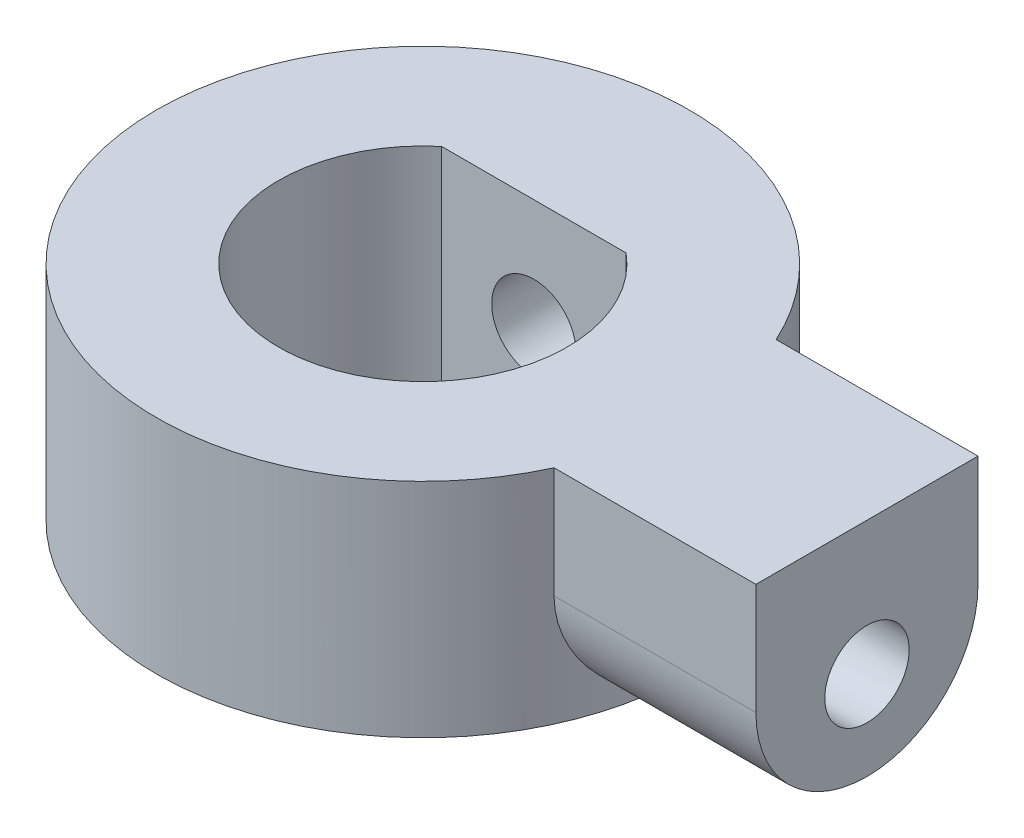
ISO-10303-21;
HEADER;
FILE_DESCRIPTION(('STEP AP214'),'2;1');
FILE_NAME('part.step','',(''),(''),'','','');
FILE_SCHEMA(('AUTOMOTIVE_DESIGN { 1 0 10303 214 1 1 1 1 }'));
ENDSEC;
DATA;
#1=APPLICATION_CONTEXT('core data for automotive mechanical design processes');
#2=APPLICATION_PROTOCOL_DEFINITION('international standard','automotive_design',2000,#1);
#3=PRODUCT_CONTEXT('',#1,'mechanical');
#4=PRODUCT('Part','Part','',(#3));
#5=PRODUCT_RELATED_PRODUCT_CATEGORY('part','',(#4));
#6=PRODUCT_DEFINITION_FORMATION('','',#4);
#7=PRODUCT_DEFINITION_CONTEXT('part definition',#1,'design');
#8=PRODUCT_DEFINITION('design','',#6,#7);
#9=PRODUCT_DEFINITION_SHAPE('','',#8);
#10=(LENGTH_UNIT() NAMED_UNIT(*) SI_UNIT(.MILLI.,.METRE.));
#11=(NAMED_UNIT(*) PLANE_ANGLE_UNIT() SI_UNIT($,.RADIAN.));
#12=(NAMED_UNIT(*) SI_UNIT($,.STERADIAN.) SOLID_ANGLE_UNIT());
#13=UNCERTAINTY_MEASURE_WITH_UNIT(LENGTH_MEASURE(1.E-05),#10,'distance_accuracy_value','');
#14=(GEOMETRIC_REPRESENTATION_CONTEXT(3) GLOBAL_UNCERTAINTY_ASSIGNED_CONTEXT((#13)) GLOBAL_UNIT_ASSIGNED_CONTEXT((#10,
#11,#12)) REPRESENTATION_CONTEXT('',''));
#15=CARTESIAN_POINT('',(0.,0.,0.));
#16=DIRECTION('',(0.,0.,1.));
#17=DIRECTION('',(1.,0.,0.));
#18=AXIS2_PLACEMENT_3D('',#15,#16,#17);
#19=CARTESIAN_POINT('',(0.,5.,0.));
#20=DIRECTION('',(0.,1.,0.));
#21=DIRECTION('',(0.,0.,1.));
#22=AXIS2_PLACEMENT_3D('',#19,#20,#21);
#23=PLANE('',#22);
#24=CARTESIAN_POINT('',(0.,5.,0.));
#25=DIRECTION('',(0.,1.,0.));
#26=DIRECTION('',(0.,0.,1.));
#27=AXIS2_PLACEMENT_3D('',#24,#25,#26);
#28=CIRCLE('',#27,6.);
#29=CARTESIAN_POINT('',(5.45435605731786,5.,-2.5));
#30=VERTEX_POINT('',#29);
#31=CARTESIAN_POINT('',(5.45435605731786,5.,2.5));
#32=VERTEX_POINT('',#31);
#33=EDGE_CURVE('E47',#30,#32,#28,.T.);
#34=ORIENTED_EDGE('',*,*,#33,.T.);
#35=DIRECTION('',(1.,0.,0.));
#36=VECTOR('',#35,1.);
#37=CARTESIAN_POINT('',(-6.001,5.,2.5));
#38=LINE('',#37,#36);
#39=CARTESIAN_POINT('',(10.,5.,2.5));
#40=VERTEX_POINT('',#39);
#41=EDGE_CURVE('E105',#32,#40,#38,.T.);
#42=ORIENTED_EDGE('',*,*,#41,.T.);
#43=DIRECTION('',(0.,0.,1.));
#44=VECTOR('',#43,1.);
#45=CARTESIAN_POINT('',(10.,5.,2.5));
#46=LINE('',#45,#44);
#47=CARTESIAN_POINT('',(10.,5.,-2.5));
#48=VERTEX_POINT('',#47);
#49=EDGE_CURVE('E164',#48,#40,#46,.T.);
#50=ORIENTED_EDGE('',*,*,#49,.F.);
#51=DIRECTION('',(1.,0.,0.));
#52=VECTOR('',#51,1.);
#53=CARTESIAN_POINT('',(-6.001,5.,-2.5));
#54=LINE('',#53,#52);
#55=EDGE_CURVE('E180',#30,#48,#54,.T.);
#56=ORIENTED_EDGE('',*,*,#55,.F.);
#57=EDGE_LOOP('',(#34,#42,#50,#56));
#58=FACE_BOUND('',#57,.T.);
#59=DIRECTION('',(-1.,0.,0.));
#60=VECTOR('',#59,1.);
#61=CARTESIAN_POINT('',(-2.07665596572952,5.,-2.5));
#62=LINE('',#61,#60);
#63=CARTESIAN_POINT('',(2.07665596572952,5.,-2.5));
#64=VERTEX_POINT('',#63);
#65=CARTESIAN_POINT('',(-2.07665596572952,5.,-2.5));
#66=VERTEX_POINT('',#65);
#67=EDGE_CURVE('E167',#64,#66,#62,.T.);
#68=ORIENTED_EDGE('',*,*,#67,.F.);
#69=CARTESIAN_POINT('',(0.,5.,0.));
#70=DIRECTION('',(0.,1.,0.));
#71=DIRECTION('',(0.,0.,1.));
#72=AXIS2_PLACEMENT_3D('',#69,#70,#71);
#73=CIRCLE('',#72,3.25);
#74=EDGE_CURVE('E162',#66,#64,#73,.T.);
#75=ORIENTED_EDGE('',*,*,#74,.F.);
#76=EDGE_LOOP('',(#68,#75));
#77=FACE_BOUND('',#76,.T.);
#78=ADVANCED_FACE('F37',(#58,#77),#23,.T.);
#79=CARTESIAN_POINT('',(0.,0.,0.));
#80=DIRECTION('',(0.,1.,0.));
#81=DIRECTION('',(0.,0.,1.));
#82=AXIS2_PLACEMENT_3D('',#79,#80,#81);
#83=PLANE('',#82);
#84=CARTESIAN_POINT('',(0.,0.,0.));
#85=DIRECTION('',(0.,1.,0.));
#86=DIRECTION('',(0.,0.,1.));
#87=AXIS2_PLACEMENT_3D('',#84,#85,#86);
#88=CIRCLE('',#87,6.);
#89=CARTESIAN_POINT('',(6.,0.,0.));
#90=VERTEX_POINT('',#89);
#91=EDGE_CURVE('E116',#90,#90,#88,.T.);
#92=ORIENTED_EDGE('',*,*,#91,.F.);
#93=EDGE_LOOP('',(#92));
#94=FACE_BOUND('',#93,.T.);
#95=CARTESIAN_POINT('',(0.,0.,0.));
#96=DIRECTION('',(0.,1.,0.));
#97=DIRECTION('',(0.,0.,1.));
#98=AXIS2_PLACEMENT_3D('',#95,#96,#97);
#99=CIRCLE('',#98,3.25);
#100=CARTESIAN_POINT('',(-2.07665596572952,0.,-2.5));
#101=VERTEX_POINT('',#100);
#102=CARTESIAN_POINT('',(2.07665596572952,0.,-2.5));
#103=VERTEX_POINT('',#102);
#104=EDGE_CURVE('E156',#101,#103,#99,.T.);
#105=ORIENTED_EDGE('',*,*,#104,.T.);
#106=DIRECTION('',(-1.,0.,0.));
#107=VECTOR('',#106,1.);
#108=CARTESIAN_POINT('',(-2.07665596572952,0.,-2.5));
#109=LINE('',#108,#107);
#110=EDGE_CURVE('E157',#103,#101,#109,.T.);
#111=ORIENTED_EDGE('',*,*,#110,.T.);
#112=EDGE_LOOP('',(#105,#111));
#113=FACE_BOUND('',#112,.T.);
#114=ADVANCED_FACE('F145',(#94,#113),#83,.F.);
#115=CARTESIAN_POINT('',(0.,5.,0.));
#116=DIRECTION('',(0.,-1.,0.));
#117=DIRECTION('',(0.,0.,-1.));
#118=AXIS2_PLACEMENT_3D('',#115,#116,#117);
#119=CYLINDRICAL_SURFACE('',#118,6.);
#120=CARTESIAN_POINT('',(0.,3.45,-6.));
#121=CARTESIAN_POINT('',(-0.0530065325431377,3.44999784247442,-5.99999911943663));
#122=CARTESIAN_POINT('',(-0.1060429328237,3.44554866162129,-5.99929023721847));
#123=CARTESIAN_POINT('',(-0.210630821019885,3.42787540710383,-5.99653060786158));
#124=CARTESIAN_POINT('',(-0.262180853919116,3.41464302074474,-5.9944785895633));
#125=CARTESIAN_POINT('',(-0.362267483212806,3.37981073380928,-5.98926307465124));
#126=CARTESIAN_POINT('',(-0.410806414129141,3.35821741200426,-5.98610045209399));
#127=CARTESIAN_POINT('',(-0.503565253669326,3.30729285605072,-5.97901235357637));
#128=CARTESIAN_POINT('',(-0.547785709361367,3.27796260377012,-5.97508697443153));
#129=CARTESIAN_POINT('',(-0.631042339550759,3.21212618428269,-5.96687118067805));
#130=CARTESIAN_POINT('',(-0.670035666337855,3.17556614987959,-5.962578172111));
#131=CARTESIAN_POINT('',(-0.741361261922617,3.09642390940615,-5.95413105122261));
#132=CARTESIAN_POINT('',(-0.773693129794643,3.0538413411244,-5.94997694727396));
#133=CARTESIAN_POINT('',(-0.830947245411496,2.96357172598603,-5.94225284052595));
#134=CARTESIAN_POINT('',(-0.855827586939495,2.9158577880124,-5.93868619016023));
#135=CARTESIAN_POINT('',(-0.897204497579997,2.81686215214227,-5.93257652760938));
#136=CARTESIAN_POINT('',(-0.913701576590684,2.76558067145146,-5.93003345316887));
#137=CARTESIAN_POINT('',(-0.937709647092883,2.66135806074548,-5.92628454466767));
#138=CARTESIAN_POINT('',(-0.945294303425467,2.60843430111831,-5.92506775447841));
#139=CARTESIAN_POINT('',(-0.951490528668378,2.50205235320494,-5.92407598286326));
#140=CARTESIAN_POINT('',(-0.950102670970175,2.44859419928739,-5.92430090930399));
#141=CARTESIAN_POINT('',(-0.938453367789073,2.34318398231397,-5.9261571457424));
#142=CARTESIAN_POINT('',(-0.928274310170595,2.29122255100579,-5.92777539758069));
#143=CARTESIAN_POINT('',(-0.899460681487422,2.18975452051614,-5.93221553010633));
#144=CARTESIAN_POINT('',(-0.880825846355845,2.14024799805299,-5.935037448383));
#145=CARTESIAN_POINT('',(-0.835545003436381,2.04484638766363,-5.9415812241455));
#146=CARTESIAN_POINT('',(-0.808864433030597,1.99896798058484,-5.94530695040069));
#147=CARTESIAN_POINT('',(-0.748274060371904,1.91230812768371,-5.95323580549352));
#148=CARTESIAN_POINT('',(-0.714363730423339,1.87152705425743,-5.95743896916855));
#149=CARTESIAN_POINT('',(-0.639825820380716,1.7957422891208,-5.96590665026745));
#150=CARTESIAN_POINT('',(-0.599127476713979,1.76080817727663,-5.97017132879133));
#151=CARTESIAN_POINT('',(-0.51240909068589,1.69825494558224,-5.97823804067464));
#152=CARTESIAN_POINT('',(-0.466389019949385,1.67063586473794,-5.98204007156704));
#153=CARTESIAN_POINT('',(-0.370270720231182,1.6234917835946,-5.98875774964505));
#154=CARTESIAN_POINT('',(-0.320169625526924,1.60397253069736,-5.99167276704191));
#155=CARTESIAN_POINT('',(-0.217344001328876,1.57364466071927,-5.9962828177001));
#156=CARTESIAN_POINT('',(-0.164619669983096,1.56283538678146,-5.99797794295772));
#157=CARTESIAN_POINT('',(-0.0586443500683351,1.55032771006647,-5.99994493994887));
#158=CARTESIAN_POINT('',(-0.00540491062864297,1.54853371746608,-6.00023174349367));
#159=CARTESIAN_POINT('',(0.100614180366432,1.55385325692318,-5.99939055035239));
#160=CARTESIAN_POINT('',(0.153393847770229,1.56096648071433,-5.99826260262888));
#161=CARTESIAN_POINT('',(0.2567028442159,1.58381903517933,-5.99472788186909));
#162=CARTESIAN_POINT('',(0.307242814998402,1.599511427333,-5.99232806964974));
#163=CARTESIAN_POINT('',(0.404974502660587,1.63902710772779,-5.98651772171067));
#164=CARTESIAN_POINT('',(0.452166046878417,1.66285081489323,-5.98310713391711));
#165=CARTESIAN_POINT('',(0.54227912712009,1.71817451705975,-5.97561683521777));
#166=CARTESIAN_POINT('',(0.585163275856447,1.74973469794675,-5.97153196430922));
#167=CARTESIAN_POINT('',(0.665060673461081,1.8195521663765,-5.96316284025496));
#168=CARTESIAN_POINT('',(0.702073539547021,1.85780989022843,-5.95887857413308));
#169=CARTESIAN_POINT('',(0.769528714004927,1.94036356441301,-5.95054571776636));
#170=CARTESIAN_POINT('',(0.79990669385026,1.98471237682184,-5.94649969076993));
#171=CARTESIAN_POINT('',(0.852781600993485,2.07793955543441,-5.93914801572325));
#172=CARTESIAN_POINT('',(0.875278759785803,2.12681778853577,-5.93584234592648));
#173=CARTESIAN_POINT('',(0.911655406206915,2.22753034640484,-5.93036455742758));
#174=CARTESIAN_POINT('',(0.92556785155129,2.27935252106063,-5.92818810870488));
#175=CARTESIAN_POINT('',(0.944484488723913,2.38463521025435,-5.92520399024441));
#176=CARTESIAN_POINT('',(0.94948937270857,2.43809559716763,-5.92439621415504));
#177=CARTESIAN_POINT('',(0.950430963049493,2.54449542857748,-5.92424517317144));
#178=CARTESIAN_POINT('',(0.946468865597068,2.59743398184011,-5.92488556502195));
#179=CARTESIAN_POINT('',(0.929806776372124,2.70188142931367,-5.9275230391771));
#180=CARTESIAN_POINT('',(0.917106805276478,2.75339032690738,-5.92952011827133));
#181=CARTESIAN_POINT('',(0.883366728284749,2.85348285329261,-5.93463998936125));
#182=CARTESIAN_POINT('',(0.862334497645782,2.90206919454349,-5.93776171813957));
#183=CARTESIAN_POINT('',(0.812537143363877,2.99504004416334,-5.94478030744071));
#184=CARTESIAN_POINT('',(0.783771698091844,3.03942437766442,-5.94867720020133));
#185=CARTESIAN_POINT('',(0.718959945246603,3.12324407340791,-5.95685922894149));
#186=CARTESIAN_POINT('',(0.682838924140906,3.16262131010834,-5.96114807761731));
#187=CARTESIAN_POINT('',(0.604499192096559,3.23479078891998,-5.96960045602466));
#188=CARTESIAN_POINT('',(0.562279071260353,3.26758150425773,-5.97376395651042));
#189=CARTESIAN_POINT('',(0.472631139560871,3.32583023565357,-5.98152612406019));
#190=CARTESIAN_POINT('',(0.425172775546269,3.35124171280744,-5.98512114379175));
#191=CARTESIAN_POINT('',(0.326625218992259,3.39369375432087,-5.99130569380135));
#192=CARTESIAN_POINT('',(0.275539777617261,3.4107428268768,-5.99389624549485));
#193=CARTESIAN_POINT('',(0.186866491581967,3.43219950003537,-5.99720126742293));
#194=CARTESIAN_POINT('',(0.149820850072254,3.43886424965036,-5.99824529554219));
#195=CARTESIAN_POINT('',(0.075188477092531,3.44776523243944,-5.99964496911413));
#196=CARTESIAN_POINT('',(0.0376017535592534,3.45000153050466,-6.0000006246537));
#197=CARTESIAN_POINT('',(0.,3.45,-6.));
#198=B_SPLINE_CURVE_WITH_KNOTS('',3,(#120,#121,#122,#123,#124,#125,#126,#127,#128,#129,#130,
#131,#132,#133,#134,#135,#136,#137,#138,#139,#140,#141,#142,#143,#144,#145,#146,#147,#148,#149,
#150,#151,#152,#153,#154,#155,#156,#157,#158,#159,#160,#161,#162,#163,#164,#165,#166,#167,#168,
#169,#170,#171,#172,#173,#174,#175,#176,#177,#178,#179,#180,#181,#182,#183,#184,#185,#186,#187,
#188,#189,#190,#191,#192,#193,#194,#195,#196,#197),.UNSPECIFIED.,.T.,.F.,(4,2,2,2,2,2,2,2,2,2,2,
2,2,2,2,2,2,2,2,2,2,2,2,2,2,2,2,2,2,2,2,2,2,2,2,2,2,2,4),(0.,0.158882175342211,
0.317914936458008,0.476822816690584,0.635710540150421,0.795830009973606,0.955959113911642,
1.11697254179806,1.27797617513446,1.43763947165269,1.59729256493611,1.75546548669785,
1.91364334840803,2.07251062669475,2.23138950457761,2.39204206899997,2.55269549005235,
2.71346271196464,2.87421780859467,3.03326475411901,3.19230619540248,3.35048606955239,
3.50867409433992,3.6681341359539,3.8276045694067,3.98855854135886,4.1495077849874,
4.30983521741785,4.47015019116278,4.62866497566682,4.78717938507059,4.94554433023382,
5.10391586291055,5.26398438669551,5.42408997208651,5.58518439891332,5.74611458100697,
5.8588240086857,5.9715317847945),.UNSPECIFIED.);
#199=CARTESIAN_POINT('',(0.,3.45,-6.));
#200=VERTEX_POINT('',#199);
#201=EDGE_CURVE('E193',#200,#200,#198,.T.);
#202=ORIENTED_EDGE('',*,*,#201,.T.);
#203=EDGE_LOOP('',(#202));
#204=FACE_BOUND('',#203,.T.);
#205=CARTESIAN_POINT('',(5.45435605731786,2.5,2.5));
#206=CARTESIAN_POINT('',(5.4543414367274,2.43300957860302,2.50001024965806));
#207=CARTESIAN_POINT('',(5.45558986423115,2.36602714239286,2.49730766074456));
#208=CARTESIAN_POINT('',(5.46050344433192,2.23260878239402,2.48655699342007));
#209=CARTESIAN_POINT('',(5.46416759753227,2.16617264410219,2.47851112553775));
#210=CARTESIAN_POINT('',(5.47378318611766,2.03459814012859,2.45719882557102));
#211=CARTESIAN_POINT('',(5.47972494833872,1.96945549511533,2.44395446621823));
#212=CARTESIAN_POINT('',(5.49369035165668,1.84065234942937,2.41239773056354));
#213=CARTESIAN_POINT('',(5.50171413528084,1.77699195055084,2.39408500729503));
#214=CARTESIAN_POINT('',(5.52852216859036,1.58902952331083,2.33184505253746));
#215=CARTESIAN_POINT('',(5.55006534458072,1.46746505908008,2.28056973965756));
#216=CARTESIAN_POINT('',(5.5980502687434,1.234605030022,2.16009667726576));
#217=CARTESIAN_POINT('',(5.62449711638194,1.12332033758376,2.09088024017802));
#218=CARTESIAN_POINT('',(5.6811173953285,0.907344481970321,1.93194216605246));
#219=CARTESIAN_POINT('',(5.71141645652258,0.803368536241449,1.84129131772596));
#220=CARTESIAN_POINT('',(5.77129106659512,0.611583063030932,1.6440247325164));
#221=CARTESIAN_POINT('',(5.80086645933832,0.523776998076489,1.53740558511415));
#222=CARTESIAN_POINT('',(5.85751079611205,0.363101171023829,1.30552662419109));
#223=CARTESIAN_POINT('',(5.88441492036276,0.291046512297456,1.17965801419141));
#224=CARTESIAN_POINT('',(5.93113050419023,0.169447605195442,0.916263349803655));
#225=CARTESIAN_POINT('',(5.95094514533806,0.119893256587166,0.778742558960747));
#226=CARTESIAN_POINT('',(5.98035028996095,0.0473214289529198,0.503538212911762));
#227=CARTESIAN_POINT('',(5.99041924152298,0.0230570539866598,0.366235636683349));
#228=CARTESIAN_POINT('',(6.00093656296527,-0.00227526789098402,0.0891608856613059));
#229=CARTESIAN_POINT('',(6.00138866214753,-0.00335220661880326,-0.0506103107853709));
#230=CARTESIAN_POINT('',(5.99290254661358,0.0170686483621995,-0.319586702683725));
#231=CARTESIAN_POINT('',(5.98453414521297,0.0371965487350955,-0.448917245472144));
#232=CARTESIAN_POINT('',(5.96013005449445,0.0971069089122018,-0.702167963543972));
#233=CARTESIAN_POINT('',(5.94409393401056,0.136890473984626,-0.826087834150439));
#234=CARTESIAN_POINT('',(5.90559715444489,0.235455783661885,-1.06727556823007));
#235=CARTESIAN_POINT('',(5.88304219015531,0.294518179304384,-1.1844130633202));
#236=CARTESIAN_POINT('',(5.83371457161593,0.429690781969099,-1.40742238732224));
#237=CARTESIAN_POINT('',(5.80694038196897,0.505807199304517,-1.51329009151026));
#238=CARTESIAN_POINT('',(5.74963576527152,0.679159033542462,-1.71867537807254));
#239=CARTESIAN_POINT('',(5.71897359653013,0.777504171258298,-1.81722082953265));
#240=CARTESIAN_POINT('',(5.65876079183101,0.989410646424858,-1.99685313522822));
#241=CARTESIAN_POINT('',(5.62921072584973,1.10297965399462,-2.07793113494236));
#242=CARTESIAN_POINT('',(5.57361619012468,1.34685465015446,-2.22284514508405));
#243=CARTESIAN_POINT('',(5.54772171984214,1.47759287347393,-2.28601504206341));
#244=CARTESIAN_POINT('',(5.5041766144793,1.74914537345688,-2.38897619183128));
#245=CARTESIAN_POINT('',(5.48651080537515,1.88994054699776,-2.4288105117282));
#246=CARTESIAN_POINT('',(5.46773287951056,2.11015084340778,-2.47065526537902));
#247=CARTESIAN_POINT('',(5.46274303006064,2.18763106678657,-2.48164099212926));
#248=CARTESIAN_POINT('',(5.45604541462647,2.34339018133954,-2.49631631258703));
#249=CARTESIAN_POINT('',(5.45433647659977,2.42166877726067,-2.50000851178052));
#250=CARTESIAN_POINT('',(5.45435605731786,2.5,-2.5));
#251=B_SPLINE_CURVE_WITH_KNOTS('',3,(#205,#206,#207,#208,#209,#210,#211,#212,#213,#214,#215,
#216,#217,#218,#219,#220,#221,#222,#223,#224,#225,#226,#227,#228,#229,#230,#231,#232,#233,#234,
#235,#236,#237,#238,#239,#240,#241,#242,#243,#244,#245,#246,#247,#248,#249,#250),.UNSPECIFIED.,
.F.,.F.,(4,2,2,2,2,2,2,2,2,2,2,2,2,2,2,2,2,2,2,2,2,2,4),(0.,0.200891876435009,0.401700695097974,
0.601665948391964,0.801644894158599,1.20075599352942,1.6002844916061,2.02212344548655,
2.44405262481498,2.88432120276328,3.32439195134774,3.74155898035476,4.15856423395471,
4.55019084443641,4.94183947919071,5.33946474085078,5.73723503589979,6.16301556467704,
6.58901142297275,7.02923147484728,7.4686364954648,7.70350874445825,7.93829707423865),.UNSPECIFIED.);
#252=CARTESIAN_POINT('',(5.45435605731786,2.5,2.5));
#253=VERTEX_POINT('',#252);
#254=EDGE_CURVE('E99',#253,#90,#251,.T.);
#255=ORIENTED_EDGE('',*,*,#254,.F.);
#256=DIRECTION('',(0.,-1.,0.));
#257=VECTOR('',#256,1.);
#258=CARTESIAN_POINT('',(5.45435605731786,5.,2.5));
#259=LINE('',#258,#257);
#260=EDGE_CURVE('E106',#32,#253,#259,.T.);
#261=ORIENTED_EDGE('',*,*,#260,.F.);
#262=ORIENTED_EDGE('',*,*,#33,.F.);
#263=DIRECTION('',(0.,-1.,0.));
#264=VECTOR('',#263,1.);
#265=CARTESIAN_POINT('',(5.45435605731786,5.,-2.5));
#266=LINE('',#265,#264);
#267=CARTESIAN_POINT('',(5.45435605731786,2.5,-2.5));
#268=VERTEX_POINT('',#267);
#269=EDGE_CURVE('E131',#268,#30,#266,.F.);
#270=ORIENTED_EDGE('',*,*,#269,.F.);
#271=CARTESIAN_POINT('',(6.,5.,0.));
#272=CARTESIAN_POINT('',(5.99999628290907,4.9999952878604,-0.133903918163791));
#273=CARTESIAN_POINT('',(5.99546656821164,4.98917868439947,-0.268039524991424));
#274=CARTESIAN_POINT('',(5.97780115788617,4.94631926190637,-0.532498019991114));
#275=CARTESIAN_POINT('',(5.96464300599791,4.91422105321848,-0.662810029808669));
#276=CARTESIAN_POINT('',(5.93112629106012,4.8301785119407,-0.915376593299225));
#277=CARTESIAN_POINT('',(5.91079213642029,4.77830140767691,-1.03765681434384));
#278=CARTESIAN_POINT('',(5.8649055925345,4.65645416697814,-1.27165974779733));
#279=CARTESIAN_POINT('',(5.83935478441347,4.58648951102524,-1.38338564416287));
#280=CARTESIAN_POINT('',(5.78415660619864,4.42674208819246,-1.59889674004597));
#281=CARTESIAN_POINT('',(5.75437507703433,4.3361973967483,-1.70208251703042));
#282=CARTESIAN_POINT('',(5.69465427085229,4.13947131609954,-1.8923196601971));
#283=CARTESIAN_POINT('',(5.66471491925558,4.03328174628491,-1.9793625312399));
#284=CARTESIAN_POINT('',(5.60642043928224,3.80194644898946,-2.13907474876483));
#285=CARTESIAN_POINT('',(5.57821573827599,3.67612510424857,-2.2108261616941));
#286=CARTESIAN_POINT('',(5.52871144633222,3.41285348305706,-2.331878813161));
#287=CARTESIAN_POINT('',(5.50740829980501,3.2754092407429,-2.38119161708799));
#288=CARTESIAN_POINT('',(5.47557110795537,2.99969261673848,-2.45349196589845));
#289=CARTESIAN_POINT('',(5.46456775308951,2.86177903328898,-2.47763315746001));
#290=CARTESIAN_POINT('',(5.45322652433633,2.58345341455361,-2.50250419944798));
#291=CARTESIAN_POINT('',(5.45288276849133,2.44304279992962,-2.5032469611117));
#292=CARTESIAN_POINT('',(5.46250239122985,2.17519987914758,-2.48216900725155));
#293=CARTESIAN_POINT('',(5.47167765447589,2.04759780687576,-2.46207362224014));
#294=CARTESIAN_POINT('',(5.49796965547249,1.79777581799454,-2.40278382032142));
#295=CARTESIAN_POINT('',(5.51508791407034,1.67555693701519,-2.36358574574513));
#296=CARTESIAN_POINT('',(5.55572369545608,1.43688459401841,-2.2664391745498));
#297=CARTESIAN_POINT('',(5.57936963898298,1.32060915817359,-2.20810943078429));
#298=CARTESIAN_POINT('',(5.63036662282146,1.09904453223936,-2.07462485161169));
#299=CARTESIAN_POINT('',(5.65771912259552,0.993759698772869,-1.99946338103921));
#300=CARTESIAN_POINT('',(5.71585953755966,0.787800082534429,-1.82699193108754));
#301=CARTESIAN_POINT('',(5.74674242808947,0.688266865229156,-1.72834696641502));
#302=CARTESIAN_POINT('',(5.80651346225057,0.506772994081608,-1.51545918210306));
#303=CARTESIAN_POINT('',(5.83540113754019,0.424816456615636,-1.40121271889693));
#304=CARTESIAN_POINT('',(5.88876567112946,0.279128352767474,-1.15689589738675));
#305=CARTESIAN_POINT('',(5.91312533086667,0.215861109698637,-1.02652116489536));
#306=CARTESIAN_POINT('',(5.95378962829607,0.112557720793478,-0.755704805053669));
#307=CARTESIAN_POINT('',(5.970098716916,0.072508736112366,-0.615268789590073));
#308=CARTESIAN_POINT('',(5.9919928237277,0.0191680157467254,-0.337856226692458));
#309=CARTESIAN_POINT('',(5.9981908209425,0.00434428511250046,-0.20122257055728));
#310=CARTESIAN_POINT('',(6.00112100737489,-0.00269244722818805,0.0727093109921761));
#311=CARTESIAN_POINT('',(5.99785591423878,0.00508805949600024,0.210007334305269));
#312=CARTESIAN_POINT('',(5.9826243531388,0.0419421696121324,0.474196484682869));
#313=CARTESIAN_POINT('',(5.97109774567979,0.0699399081943904,0.601265933278774));
#314=CARTESIAN_POINT('',(5.94097213544829,0.144936389081568,0.848765497942178));
#315=CARTESIAN_POINT('',(5.92237223919408,0.191937531900609,0.969194773036711));
#316=CARTESIAN_POINT('',(5.87916541290331,0.305141951424225,1.20421799973828));
#317=CARTESIAN_POINT('',(5.85438982938561,0.371896366292037,1.31851447371068));
#318=CARTESIAN_POINT('',(5.80147609158182,0.522106755583414,1.53469243246282));
#319=CARTESIAN_POINT('',(5.77333653537473,0.605569703058646,1.63656870520375));
#320=CARTESIAN_POINT('',(5.71424175790867,0.793806466544705,1.83266686054867));
#321=CARTESIAN_POINT('',(5.68322903182028,0.899677005972104,1.92582139596023));
#322=CARTESIAN_POINT('',(5.6236867353604,1.1260425518712,2.09333969221046));
#323=CARTESIAN_POINT('',(5.59515772986987,1.24654087034502,2.16769918571027));
#324=CARTESIAN_POINT('',(5.54362772487864,1.50122835060358,2.2963192041761));
#325=CARTESIAN_POINT('',(5.52071125109802,1.63558807102374,2.35027836475451));
#326=CARTESIAN_POINT('',(5.48416711318335,1.91274118762612,2.43434827902353));
#327=CARTESIAN_POINT('',(5.47053179113073,2.05552752498876,2.46447869724417));
#328=CARTESIAN_POINT('',(5.4552632907308,2.33363739837805,2.49808160700532));
#329=CARTESIAN_POINT('',(5.45278701929114,2.46868932451194,2.50342760836084));
#330=CARTESIAN_POINT('',(5.45787706027259,2.73768572235547,2.49231151038001));
#331=CARTESIAN_POINT('',(5.46544183100007,2.8716303609001,2.47585275892879));
#332=CARTESIAN_POINT('',(5.48899102586044,3.12818549467776,2.42316809595844));
#333=CARTESIAN_POINT('',(5.50456709625453,3.25103334597753,2.38789807270203));
#334=CARTESIAN_POINT('',(5.54206362465904,3.48909604366397,2.29952656276963));
#335=CARTESIAN_POINT('',(5.56398586515028,3.60430873433601,2.24642006560089));
#336=CARTESIAN_POINT('',(5.61333908853254,3.83139178814704,2.1202057237392));
#337=CARTESIAN_POINT('',(5.64102204404079,3.94264464594781,2.04608723750136));
#338=CARTESIAN_POINT('',(5.69807379131314,4.15172029311513,1.88136812596239));
#339=CARTESIAN_POINT('',(5.72744316520044,4.24953840503241,1.79076178563716));
#340=CARTESIAN_POINT('',(5.78712781593092,4.43629730561753,1.58780416898838));
#341=CARTESIAN_POINT('',(5.8173561917501,4.5240726428278,1.47434977868814));
#342=CARTESIAN_POINT('',(5.87320303099821,4.67939913004211,1.23319985958043));
#343=CARTESIAN_POINT('',(5.89881939160172,4.74694106399683,1.1054978774169));
#344=CARTESIAN_POINT('',(5.94218308378896,4.8584188704516,0.841465213422197));
#345=CARTESIAN_POINT('',(5.96005349044659,4.90272649429008,0.70531205641587));
#346=CARTESIAN_POINT('',(5.9864223497589,4.96741568752959,0.426816782070271));
#347=CARTESIAN_POINT('',(5.99495014042422,4.98787216820581,0.284495506121993));
#348=CARTESIAN_POINT('',(5.99888566614292,4.99732384178621,0.118052512349441));
#349=CARTESIAN_POINT('',(5.99930292614998,4.99832660250302,0.0944569348794063));
#350=CARTESIAN_POINT('',(5.99986042138656,4.99966509825678,0.0472433090693387));
#351=CARTESIAN_POINT('',(6.0000006558228,5.00000083138364,0.0236252606651518));
#352=CARTESIAN_POINT('',(6.,5.,0.));
#353=B_SPLINE_CURVE_WITH_KNOTS('',3,(#271,#272,#273,#274,#275,#276,#277,#278,#279,#280,#281,
#282,#283,#284,#285,#286,#287,#288,#289,#290,#291,#292,#293,#294,#295,#296,#297,#298,#299,#300,
#301,#302,#303,#304,#305,#306,#307,#308,#309,#310,#311,#312,#313,#314,#315,#316,#317,#318,#319,
#320,#321,#322,#323,#324,#325,#326,#327,#328,#329,#330,#331,#332,#333,#334,#335,#336,#337,#338,
#339,#340,#341,#342,#343,#344,#345,#346,#347,#348,#349,#350,#351,#352),.UNSPECIFIED.,.T.,.F.,(4,
2,2,2,2,2,2,2,2,2,2,2,2,2,2,2,2,2,2,2,2,2,2,2,2,2,2,2,2,2,2,2,2,2,2,2,2,2,2,2,4),(0.,
0.401613837767877,0.804277081257393,1.2055837038126,1.60676887370595,2.02635872577614,
2.44616876262931,2.88663449078251,3.32687293461176,3.74590546275115,4.16470676498092,
4.55140314405113,4.93817359454425,5.33317426117429,5.72833091434413,6.15688282255793,
6.58553498629176,7.02408110121627,7.46238448436594,7.87296886786502,8.28343534986344,
8.67353179471443,9.0636775320357,9.46594270544322,9.86837610938992,10.2995697605859,
10.7308612248068,11.1682957671905,11.6053689414916,12.0087975511929,12.4121642259507,
12.7967529992953,13.1814498990123,13.5892778679488,13.9972474685189,14.4349307000978,
14.8728129885717,15.3034571163877,15.7327450093864,15.8036033125922,15.8744618187069),.UNSPECIFIED.);
#354=EDGE_CURVE('E11',#268,#90,#353,.T.);
#355=ORIENTED_EDGE('',*,*,#354,.T.);
#356=ORIENTED_EDGE('',*,*,#91,.T.);
#357=EDGE_LOOP('',(#255,#261,#262,#270,#355,#356));
#358=FACE_BOUND('',#357,.T.);
#359=ADVANCED_FACE('F39',(#204,#358),#119,.T.);
#360=CARTESIAN_POINT('',(0.,5.,0.));
#361=DIRECTION('',(0.,-1.,0.));
#362=DIRECTION('',(0.,0.,-1.));
#363=AXIS2_PLACEMENT_3D('',#360,#361,#362);
#364=CYLINDRICAL_SURFACE('',#363,3.25);
#365=ORIENTED_EDGE('',*,*,#104,.F.);
#366=DIRECTION('',(0.,-1.,0.));
#367=VECTOR('',#366,1.);
#368=CARTESIAN_POINT('',(-2.07665596572952,5.,-2.5));
#369=LINE('',#368,#367);
#370=EDGE_CURVE('E170',#66,#101,#369,.T.);
#371=ORIENTED_EDGE('',*,*,#370,.F.);
#372=ORIENTED_EDGE('',*,*,#74,.T.);
#373=DIRECTION('',(0.,-1.,0.));
#374=VECTOR('',#373,1.);
#375=CARTESIAN_POINT('',(2.07665596572952,5.,-2.5));
#376=LINE('',#375,#374);
#377=EDGE_CURVE('E62',#64,#103,#376,.T.);
#378=ORIENTED_EDGE('',*,*,#377,.T.);
#379=EDGE_LOOP('',(#365,#371,#372,#378));
#380=FACE_BOUND('',#379,.T.);
#381=ADVANCED_FACE('F139',(#380),#364,.F.);
#382=CARTESIAN_POINT('',(-2.07665596572952,5.,-2.5));
#383=DIRECTION('',(0.,0.,1.));
#384=DIRECTION('',(1.,0.,0.));
#385=AXIS2_PLACEMENT_3D('',#382,#383,#384);
#386=PLANE('',#385);
#387=CARTESIAN_POINT('',(0.,2.5,-2.5));
#388=DIRECTION('',(0.,0.,1.));
#389=DIRECTION('',(1.,0.,0.));
#390=AXIS2_PLACEMENT_3D('',#387,#388,#389);
#391=CIRCLE('',#390,0.95);
#392=CARTESIAN_POINT('',(0.95,2.5,-2.5));
#393=VERTEX_POINT('',#392);
#394=EDGE_CURVE('E42',#393,#393,#391,.T.);
#395=ORIENTED_EDGE('',*,*,#394,.F.);
#396=EDGE_LOOP('',(#395));
#397=FACE_BOUND('',#396,.T.);
#398=ORIENTED_EDGE('',*,*,#110,.F.);
#399=ORIENTED_EDGE('',*,*,#377,.F.);
#400=ORIENTED_EDGE('',*,*,#67,.T.);
#401=ORIENTED_EDGE('',*,*,#370,.T.);
#402=EDGE_LOOP('',(#398,#399,#400,#401));
#403=FACE_BOUND('',#402,.T.);
#404=ADVANCED_FACE('F136',(#397,#403),#386,.T.);
#405=CARTESIAN_POINT('',(-6.001,2.5,0.));
#406=DIRECTION('',(1.,0.,0.));
#407=DIRECTION('',(0.,0.,-1.));
#408=AXIS2_PLACEMENT_3D('',#405,#406,#407);
#409=CYLINDRICAL_SURFACE('',#408,2.5);
#410=DIRECTION('',(1.,0.,0.));
#411=VECTOR('',#410,1.);
#412=CARTESIAN_POINT('',(-6.001,2.5,2.5));
#413=LINE('',#412,#411);
#414=CARTESIAN_POINT('',(10.,2.5,2.5));
#415=VERTEX_POINT('',#414);
#416=EDGE_CURVE('E95',#253,#415,#413,.T.);
#417=ORIENTED_EDGE('',*,*,#416,.F.);
#418=ORIENTED_EDGE('',*,*,#254,.T.);
#419=ORIENTED_EDGE('',*,*,#354,.F.);
#420=DIRECTION('',(1.,0.,0.));
#421=VECTOR('',#420,1.);
#422=CARTESIAN_POINT('',(-6.001,2.5,-2.5));
#423=LINE('',#422,#421);
#424=CARTESIAN_POINT('',(10.,2.5,-2.5));
#425=VERTEX_POINT('',#424);
#426=EDGE_CURVE('E54',#268,#425,#423,.T.);
#427=ORIENTED_EDGE('',*,*,#426,.T.);
#428=CARTESIAN_POINT('',(10.,2.5,0.));
#429=DIRECTION('',(1.,0.,0.));
#430=DIRECTION('',(0.,0.,-1.));
#431=AXIS2_PLACEMENT_3D('',#428,#429,#430);
#432=CIRCLE('',#431,2.5);
#433=EDGE_CURVE('E101',#415,#425,#432,.T.);
#434=ORIENTED_EDGE('',*,*,#433,.F.);
#435=EDGE_LOOP('',(#417,#418,#419,#427,#434));
#436=FACE_BOUND('',#435,.T.);
#437=ADVANCED_FACE('F97',(#436),#409,.T.);
#438=CARTESIAN_POINT('',(-6.001,2.5,2.5));
#439=DIRECTION('',(0.,0.,1.));
#440=DIRECTION('',(0.,-1.,0.));
#441=AXIS2_PLACEMENT_3D('',#438,#439,#440);
#442=PLANE('',#441);
#443=ORIENTED_EDGE('',*,*,#41,.F.);
#444=ORIENTED_EDGE('',*,*,#260,.T.);
#445=ORIENTED_EDGE('',*,*,#416,.T.);
#446=DIRECTION('',(0.,-1.,0.));
#447=VECTOR('',#446,1.);
#448=CARTESIAN_POINT('',(10.,2.5,2.5));
#449=LINE('',#448,#447);
#450=EDGE_CURVE('E160',#40,#415,#449,.T.);
#451=ORIENTED_EDGE('',*,*,#450,.F.);
#452=EDGE_LOOP('',(#443,#444,#445,#451));
#453=FACE_BOUND('',#452,.T.);
#454=ADVANCED_FACE('F109',(#453),#442,.T.);
#455=CARTESIAN_POINT('',(-6.001,5.,-2.5));
#456=DIRECTION('',(0.,0.,-1.));
#457=DIRECTION('',(-1.,0.,0.));
#458=AXIS2_PLACEMENT_3D('',#455,#456,#457);
#459=PLANE('',#458);
#460=ORIENTED_EDGE('',*,*,#426,.F.);
#461=ORIENTED_EDGE('',*,*,#269,.T.);
#462=ORIENTED_EDGE('',*,*,#55,.T.);
#463=DIRECTION('',(0.,1.,0.));
#464=VECTOR('',#463,1.);
#465=CARTESIAN_POINT('',(10.,5.,-2.5));
#466=LINE('',#465,#464);
#467=EDGE_CURVE('E186',#425,#48,#466,.T.);
#468=ORIENTED_EDGE('',*,*,#467,.F.);
#469=EDGE_LOOP('',(#460,#461,#462,#468));
#470=FACE_BOUND('',#469,.T.);
#471=ADVANCED_FACE('F216',(#470),#459,.T.);
#472=CARTESIAN_POINT('',(10.,2.5,0.));
#473=DIRECTION('',(1.,0.,0.));
#474=DIRECTION('',(0.,0.,-1.));
#475=AXIS2_PLACEMENT_3D('',#472,#473,#474);
#476=PLANE('',#475);
#477=CARTESIAN_POINT('',(10.,2.,0.));
#478=DIRECTION('',(1.,0.,0.));
#479=DIRECTION('',(0.,0.,-1.));
#480=AXIS2_PLACEMENT_3D('',#477,#478,#479);
#481=CIRCLE('',#480,0.95);
#482=CARTESIAN_POINT('',(10.,2.,-0.95));
#483=VERTEX_POINT('',#482);
#484=EDGE_CURVE('E121',#483,#483,#481,.T.);
#485=ORIENTED_EDGE('',*,*,#484,.F.);
#486=EDGE_LOOP('',(#485));
#487=FACE_BOUND('',#486,.T.);
#488=ORIENTED_EDGE('',*,*,#433,.T.);
#489=ORIENTED_EDGE('',*,*,#467,.T.);
#490=ORIENTED_EDGE('',*,*,#49,.T.);
#491=ORIENTED_EDGE('',*,*,#450,.T.);
#492=EDGE_LOOP('',(#488,#489,#490,#491));
#493=FACE_BOUND('',#492,.T.);
#494=ADVANCED_FACE('F212',(#487,#493),#476,.T.);
#495=CARTESIAN_POINT('',(8.,2.,0.));
#496=DIRECTION('',(1.,0.,0.));
#497=DIRECTION('',(0.,0.,-1.));
#498=AXIS2_PLACEMENT_3D('',#495,#496,#497);
#499=CYLINDRICAL_SURFACE('',#498,0.95);
#500=CARTESIAN_POINT('',(8.,2.,0.));
#501=DIRECTION('',(1.,0.,0.));
#502=DIRECTION('',(0.,0.,-1.));
#503=AXIS2_PLACEMENT_3D('',#500,#501,#502);
#504=CIRCLE('',#503,0.95);
#505=CARTESIAN_POINT('',(8.,2.,-0.95));
#506=VERTEX_POINT('',#505);
#507=EDGE_CURVE('E117',#506,#506,#504,.T.);
#508=ORIENTED_EDGE('',*,*,#507,.F.);
#509=EDGE_LOOP('',(#508));
#510=FACE_BOUND('',#509,.T.);
#511=ORIENTED_EDGE('',*,*,#484,.T.);
#512=EDGE_LOOP('',(#511));
#513=FACE_BOUND('',#512,.T.);
#514=ADVANCED_FACE('F208',(#510,#513),#499,.F.);
#515=CARTESIAN_POINT('',(8.,2.,0.));
#516=DIRECTION('',(1.,0.,0.));
#517=DIRECTION('',(0.,0.,-1.));
#518=AXIS2_PLACEMENT_3D('',#515,#516,#517);
#519=PLANE('',#518);
#520=ORIENTED_EDGE('',*,*,#507,.T.);
#521=EDGE_LOOP('',(#520));
#522=FACE_BOUND('',#521,.T.);
#523=ADVANCED_FACE('F204',(#522),#519,.T.);
#524=CARTESIAN_POINT('',(0.,2.5,-8.));
#525=DIRECTION('',(0.,0.,1.));
#526=DIRECTION('',(1.,0.,0.));
#527=AXIS2_PLACEMENT_3D('',#524,#525,#526);
#528=CYLINDRICAL_SURFACE('',#527,0.95);
#529=ORIENTED_EDGE('',*,*,#394,.T.);
#530=EDGE_LOOP('',(#529));
#531=FACE_BOUND('',#530,.T.);
#532=ORIENTED_EDGE('',*,*,#201,.F.);
#533=EDGE_LOOP('',(#532));
#534=FACE_BOUND('',#533,.T.);
#535=ADVANCED_FACE('F200',(#531,#534),#528,.F.);
#536=CLOSED_SHELL('',(#78,#114,#359,#381,#404,#437,#454,#471,#494,#514,#523,#535));
#537=MANIFOLD_SOLID_BREP('B2',#536);
#538=ADVANCED_BREP_SHAPE_REPRESENTATION('',(#18,#537),#14);
#539=SHAPE_DEFINITION_REPRESENTATION(#9,#538);
ENDSEC;
END-ISO-10303-21;
